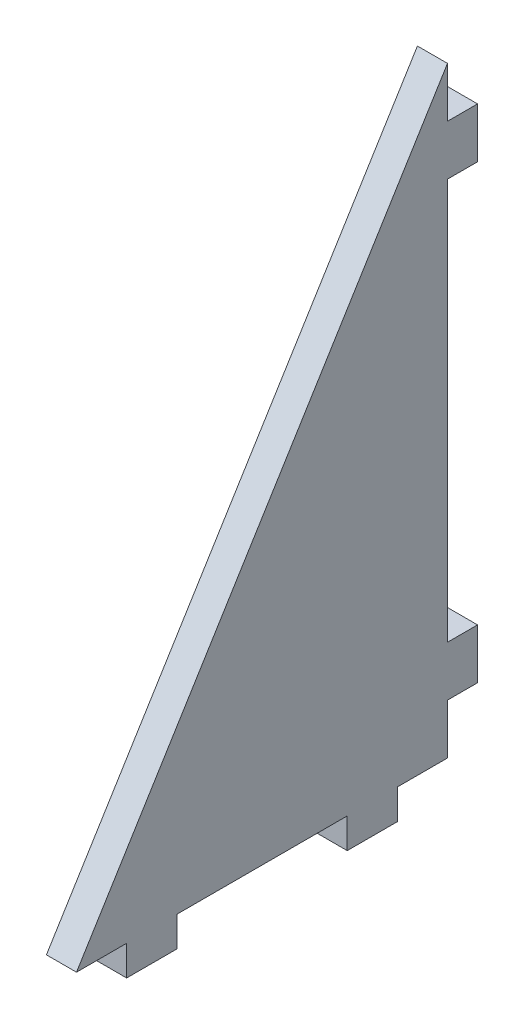
ISO-10303-21;
HEADER;
FILE_DESCRIPTION(('STEP AP214'),'2;1');
FILE_NAME('part.step','',(''),(''),'','','');
FILE_SCHEMA(('AUTOMOTIVE_DESIGN { 1 0 10303 214 1 1 1 1 }'));
ENDSEC;
DATA;
#1=APPLICATION_CONTEXT('core data for automotive mechanical design processes');
#2=APPLICATION_PROTOCOL_DEFINITION('international standard','automotive_design',2000,#1);
#3=PRODUCT_CONTEXT('',#1,'mechanical');
#4=PRODUCT('Part','Part','',(#3));
#5=PRODUCT_RELATED_PRODUCT_CATEGORY('part','',(#4));
#6=PRODUCT_DEFINITION_FORMATION('','',#4);
#7=PRODUCT_DEFINITION_CONTEXT('part definition',#1,'design');
#8=PRODUCT_DEFINITION('design','',#6,#7);
#9=PRODUCT_DEFINITION_SHAPE('','',#8);
#10=(LENGTH_UNIT() NAMED_UNIT(*) SI_UNIT(.MILLI.,.METRE.));
#11=(NAMED_UNIT(*) PLANE_ANGLE_UNIT() SI_UNIT($,.RADIAN.));
#12=(NAMED_UNIT(*) SI_UNIT($,.STERADIAN.) SOLID_ANGLE_UNIT());
#13=UNCERTAINTY_MEASURE_WITH_UNIT(LENGTH_MEASURE(1.E-05),#10,'distance_accuracy_value','');
#14=(GEOMETRIC_REPRESENTATION_CONTEXT(3) GLOBAL_UNCERTAINTY_ASSIGNED_CONTEXT((#13)) GLOBAL_UNIT_ASSIGNED_CONTEXT((#10,
#11,#12)) REPRESENTATION_CONTEXT('',''));
#15=CARTESIAN_POINT('',(0.,0.,0.));
#16=DIRECTION('',(0.,0.,1.));
#17=DIRECTION('',(1.,0.,0.));
#18=AXIS2_PLACEMENT_3D('',#15,#16,#17);
#19=CARTESIAN_POINT('',(3.,-30.,-18.5));
#20=DIRECTION('',(0.,0.,1.));
#21=DIRECTION('',(1.,0.,0.));
#22=AXIS2_PLACEMENT_3D('',#19,#20,#21);
#23=PLANE('',#22);
#24=DIRECTION('',(-1.,0.,0.));
#25=VECTOR('',#24,1.);
#26=CARTESIAN_POINT('',(3.,20.,-18.5));
#27=LINE('',#26,#25);
#28=CARTESIAN_POINT('',(3.,20.,-18.5));
#29=VERTEX_POINT('',#28);
#30=CARTESIAN_POINT('',(0.,20.,-18.5));
#31=VERTEX_POINT('',#30);
#32=EDGE_CURVE('E55',#29,#31,#27,.T.);
#33=ORIENTED_EDGE('',*,*,#32,.F.);
#34=DIRECTION('',(0.,1.,0.));
#35=VECTOR('',#34,1.);
#36=CARTESIAN_POINT('',(3.,-30.,-18.5));
#37=LINE('',#36,#35);
#38=CARTESIAN_POINT('',(3.,-20.,-18.5));
#39=VERTEX_POINT('',#38);
#40=EDGE_CURVE('E188',#39,#29,#37,.T.);
#41=ORIENTED_EDGE('',*,*,#40,.F.);
#42=DIRECTION('',(1.,0.,0.));
#43=VECTOR('',#42,1.);
#44=CARTESIAN_POINT('',(3.,-20.,-18.5));
#45=LINE('',#44,#43);
#46=CARTESIAN_POINT('',(0.,-20.,-18.5));
#47=VERTEX_POINT('',#46);
#48=EDGE_CURVE('E192',#47,#39,#45,.T.);
#49=ORIENTED_EDGE('',*,*,#48,.F.);
#50=DIRECTION('',(0.,1.,0.));
#51=VECTOR('',#50,1.);
#52=CARTESIAN_POINT('',(0.,-30.,-18.5));
#53=LINE('',#52,#51);
#54=EDGE_CURVE('E292',#47,#31,#53,.T.);
#55=ORIENTED_EDGE('',*,*,#54,.T.);
#56=EDGE_LOOP('',(#33,#41,#49,#55));
#57=FACE_BOUND('',#56,.T.);
#58=ADVANCED_FACE('F33',(#57),#23,.F.);
#59=DIRECTION('',(1.,0.,0.));
#60=VECTOR('',#59,1.);
#61=CARTESIAN_POINT('',(3.,25.,-18.5));
#62=LINE('',#61,#60);
#63=CARTESIAN_POINT('',(0.,25.,-18.5));
#64=VERTEX_POINT('',#63);
#65=CARTESIAN_POINT('',(3.,25.,-18.5));
#66=VERTEX_POINT('',#65);
#67=EDGE_CURVE('E183',#64,#66,#62,.T.);
#68=ORIENTED_EDGE('',*,*,#67,.F.);
#69=CARTESIAN_POINT('',(0.,30.,-18.5));
#70=VERTEX_POINT('',#69);
#71=EDGE_CURVE('E278',#64,#70,#53,.T.);
#72=ORIENTED_EDGE('',*,*,#71,.T.);
#73=DIRECTION('',(-1.,0.,0.));
#74=VECTOR('',#73,1.);
#75=CARTESIAN_POINT('',(3.,30.,-18.5));
#76=LINE('',#75,#74);
#77=CARTESIAN_POINT('',(3.,30.,-18.5));
#78=VERTEX_POINT('',#77);
#79=EDGE_CURVE('E11',#78,#70,#76,.T.);
#80=ORIENTED_EDGE('',*,*,#79,.F.);
#81=EDGE_CURVE('E47',#66,#78,#37,.T.);
#82=ORIENTED_EDGE('',*,*,#81,.F.);
#83=EDGE_LOOP('',(#68,#72,#80,#82));
#84=FACE_BOUND('',#83,.T.);
#85=ADVANCED_FACE('F315',(#84),#23,.F.);
#86=DIRECTION('',(-1.,0.,0.));
#87=VECTOR('',#86,1.);
#88=CARTESIAN_POINT('',(3.,-25.,-18.5));
#89=LINE('',#88,#87);
#90=CARTESIAN_POINT('',(3.,-25.,-18.5));
#91=VERTEX_POINT('',#90);
#92=CARTESIAN_POINT('',(0.,-25.,-18.5));
#93=VERTEX_POINT('',#92);
#94=EDGE_CURVE('E189',#91,#93,#89,.T.);
#95=ORIENTED_EDGE('',*,*,#94,.F.);
#96=CARTESIAN_POINT('',(3.,-30.,-18.5));
#97=VERTEX_POINT('',#96);
#98=EDGE_CURVE('E281',#97,#91,#37,.T.);
#99=ORIENTED_EDGE('',*,*,#98,.F.);
#100=DIRECTION('',(-1.,0.,0.));
#101=VECTOR('',#100,1.);
#102=CARTESIAN_POINT('',(3.,-30.,-18.5));
#103=LINE('',#102,#101);
#104=CARTESIAN_POINT('',(0.,-30.,-18.5));
#105=VERTEX_POINT('',#104);
#106=EDGE_CURVE('E287',#97,#105,#103,.T.);
#107=ORIENTED_EDGE('',*,*,#106,.T.);
#108=EDGE_CURVE('E289',#105,#93,#53,.T.);
#109=ORIENTED_EDGE('',*,*,#108,.T.);
#110=EDGE_LOOP('',(#95,#99,#107,#109));
#111=FACE_BOUND('',#110,.T.);
#112=ADVANCED_FACE('F338',(#111),#23,.F.);
#113=CARTESIAN_POINT('',(3.,-30.,18.5));
#114=DIRECTION('',(0.,1.,0.));
#115=DIRECTION('',(0.,0.,1.));
#116=AXIS2_PLACEMENT_3D('',#113,#114,#115);
#117=PLANE('',#116);
#118=DIRECTION('',(-1.,0.,0.));
#119=VECTOR('',#118,1.);
#120=CARTESIAN_POINT('',(3.,-30.,-8.5));
#121=LINE('',#120,#119);
#122=CARTESIAN_POINT('',(3.,-30.,-8.5));
#123=VERTEX_POINT('',#122);
#124=CARTESIAN_POINT('',(0.,-30.,-8.5));
#125=VERTEX_POINT('',#124);
#126=EDGE_CURVE('E220',#123,#125,#121,.T.);
#127=ORIENTED_EDGE('',*,*,#126,.F.);
#128=DIRECTION('',(0.,0.,-1.));
#129=VECTOR('',#128,1.);
#130=CARTESIAN_POINT('',(3.,-30.,18.5));
#131=LINE('',#130,#129);
#132=CARTESIAN_POINT('',(3.,-30.,8.5));
#133=VERTEX_POINT('',#132);
#134=EDGE_CURVE('E288',#133,#123,#131,.T.);
#135=ORIENTED_EDGE('',*,*,#134,.F.);
#136=DIRECTION('',(1.,0.,0.));
#137=VECTOR('',#136,1.);
#138=CARTESIAN_POINT('',(0.,-30.,8.5));
#139=LINE('',#138,#137);
#140=CARTESIAN_POINT('',(0.,-30.,8.5));
#141=VERTEX_POINT('',#140);
#142=EDGE_CURVE('E247',#141,#133,#139,.T.);
#143=ORIENTED_EDGE('',*,*,#142,.F.);
#144=DIRECTION('',(0.,0.,-1.));
#145=VECTOR('',#144,1.);
#146=CARTESIAN_POINT('',(0.,-30.,18.5));
#147=LINE('',#146,#145);
#148=EDGE_CURVE('E295',#141,#125,#147,.T.);
#149=ORIENTED_EDGE('',*,*,#148,.T.);
#150=EDGE_LOOP('',(#127,#135,#143,#149));
#151=FACE_BOUND('',#150,.T.);
#152=ADVANCED_FACE('F343',(#151),#117,.F.);
#153=DIRECTION('',(1.,0.,0.));
#154=VECTOR('',#153,1.);
#155=CARTESIAN_POINT('',(3.,-30.,-13.5));
#156=LINE('',#155,#154);
#157=CARTESIAN_POINT('',(0.,-30.,-13.5));
#158=VERTEX_POINT('',#157);
#159=CARTESIAN_POINT('',(3.,-30.,-13.5));
#160=VERTEX_POINT('',#159);
#161=EDGE_CURVE('E225',#158,#160,#156,.T.);
#162=ORIENTED_EDGE('',*,*,#161,.F.);
#163=EDGE_CURVE('E291',#158,#105,#147,.T.);
#164=ORIENTED_EDGE('',*,*,#163,.T.);
#165=ORIENTED_EDGE('',*,*,#106,.F.);
#166=EDGE_CURVE('E283',#160,#97,#131,.T.);
#167=ORIENTED_EDGE('',*,*,#166,.F.);
#168=EDGE_LOOP('',(#162,#164,#165,#167));
#169=FACE_BOUND('',#168,.T.);
#170=ADVANCED_FACE('F348',(#169),#117,.F.);
#171=DIRECTION('',(-1.,0.,0.));
#172=VECTOR('',#171,1.);
#173=CARTESIAN_POINT('',(0.,-30.,13.5));
#174=LINE('',#173,#172);
#175=CARTESIAN_POINT('',(3.,-30.,13.5));
#176=VERTEX_POINT('',#175);
#177=CARTESIAN_POINT('',(0.,-30.,13.5));
#178=VERTEX_POINT('',#177);
#179=EDGE_CURVE('E252',#176,#178,#174,.T.);
#180=ORIENTED_EDGE('',*,*,#179,.F.);
#181=CARTESIAN_POINT('',(3.,-30.,18.5));
#182=VERTEX_POINT('',#181);
#183=EDGE_CURVE('E284',#182,#176,#131,.T.);
#184=ORIENTED_EDGE('',*,*,#183,.F.);
#185=DIRECTION('',(-1.,0.,0.));
#186=VECTOR('',#185,1.);
#187=CARTESIAN_POINT('',(3.,-30.,18.5));
#188=LINE('',#187,#186);
#189=CARTESIAN_POINT('',(0.,-30.,18.5));
#190=VERTEX_POINT('',#189);
#191=EDGE_CURVE('E40',#182,#190,#188,.T.);
#192=ORIENTED_EDGE('',*,*,#191,.T.);
#193=EDGE_CURVE('E293',#190,#178,#147,.T.);
#194=ORIENTED_EDGE('',*,*,#193,.T.);
#195=EDGE_LOOP('',(#180,#184,#192,#194));
#196=FACE_BOUND('',#195,.T.);
#197=ADVANCED_FACE('F301',(#196),#117,.F.);
#198=CARTESIAN_POINT('',(3.,0.,0.));
#199=DIRECTION('',(-1.,0.,0.));
#200=DIRECTION('',(0.,0.,1.));
#201=AXIS2_PLACEMENT_3D('',#198,#199,#200);
#202=PLANE('',#201);
#203=ORIENTED_EDGE('',*,*,#98,.T.);
#204=DIRECTION('',(0.,0.,1.));
#205=VECTOR('',#204,1.);
#206=CARTESIAN_POINT('',(3.,-25.,-21.5));
#207=LINE('',#206,#205);
#208=CARTESIAN_POINT('',(3.,-25.,-21.5));
#209=VERTEX_POINT('',#208);
#210=EDGE_CURVE('E217',#209,#91,#207,.T.);
#211=ORIENTED_EDGE('',*,*,#210,.F.);
#212=DIRECTION('',(0.,-1.,0.));
#213=VECTOR('',#212,1.);
#214=CARTESIAN_POINT('',(3.,-25.,-21.5));
#215=LINE('',#214,#213);
#216=CARTESIAN_POINT('',(3.,-20.,-21.5));
#217=VERTEX_POINT('',#216);
#218=EDGE_CURVE('E198',#217,#209,#215,.T.);
#219=ORIENTED_EDGE('',*,*,#218,.F.);
#220=DIRECTION('',(0.,0.,1.));
#221=VECTOR('',#220,1.);
#222=CARTESIAN_POINT('',(3.,-20.,-21.5));
#223=LINE('',#222,#221);
#224=EDGE_CURVE('E206',#217,#39,#223,.T.);
#225=ORIENTED_EDGE('',*,*,#224,.T.);
#226=ORIENTED_EDGE('',*,*,#40,.T.);
#227=DIRECTION('',(0.,0.,1.));
#228=VECTOR('',#227,1.);
#229=CARTESIAN_POINT('',(3.,20.,-21.5));
#230=LINE('',#229,#228);
#231=CARTESIAN_POINT('',(3.,20.,-21.5));
#232=VERTEX_POINT('',#231);
#233=EDGE_CURVE('E168',#232,#29,#230,.T.);
#234=ORIENTED_EDGE('',*,*,#233,.F.);
#235=DIRECTION('',(0.,-1.,0.));
#236=VECTOR('',#235,1.);
#237=CARTESIAN_POINT('',(3.,20.,-21.5));
#238=LINE('',#237,#236);
#239=CARTESIAN_POINT('',(3.,25.,-21.5));
#240=VERTEX_POINT('',#239);
#241=EDGE_CURVE('E174',#240,#232,#238,.T.);
#242=ORIENTED_EDGE('',*,*,#241,.F.);
#243=DIRECTION('',(0.,0.,1.));
#244=VECTOR('',#243,1.);
#245=CARTESIAN_POINT('',(3.,25.,-21.5));
#246=LINE('',#245,#244);
#247=EDGE_CURVE('E322',#240,#66,#246,.T.);
#248=ORIENTED_EDGE('',*,*,#247,.T.);
#249=ORIENTED_EDGE('',*,*,#81,.T.);
#250=DIRECTION('',(0.,0.85117086972399,-0.524888702996461));
#251=VECTOR('',#250,1.);
#252=CARTESIAN_POINT('',(3.,-30.,18.5));
#253=LINE('',#252,#251);
#254=EDGE_CURVE('E274',#182,#78,#253,.T.);
#255=ORIENTED_EDGE('',*,*,#254,.F.);
#256=ORIENTED_EDGE('',*,*,#183,.T.);
#257=DIRECTION('',(0.,1.,0.));
#258=VECTOR('',#257,1.);
#259=CARTESIAN_POINT('',(3.,-33.,13.5));
#260=LINE('',#259,#258);
#261=CARTESIAN_POINT('',(3.,-33.,13.5));
#262=VERTEX_POINT('',#261);
#263=EDGE_CURVE('E265',#262,#176,#260,.T.);
#264=ORIENTED_EDGE('',*,*,#263,.F.);
#265=DIRECTION('',(0.,0.,1.));
#266=VECTOR('',#265,1.);
#267=CARTESIAN_POINT('',(3.,-33.,13.5));
#268=LINE('',#267,#266);
#269=CARTESIAN_POINT('',(3.,-33.,8.5));
#270=VERTEX_POINT('',#269);
#271=EDGE_CURVE('E254',#270,#262,#268,.T.);
#272=ORIENTED_EDGE('',*,*,#271,.F.);
#273=DIRECTION('',(0.,1.,0.));
#274=VECTOR('',#273,1.);
#275=CARTESIAN_POINT('',(3.,-33.,8.5));
#276=LINE('',#275,#274);
#277=EDGE_CURVE('E268',#270,#133,#276,.T.);
#278=ORIENTED_EDGE('',*,*,#277,.T.);
#279=ORIENTED_EDGE('',*,*,#134,.T.);
#280=DIRECTION('',(0.,1.,0.));
#281=VECTOR('',#280,1.);
#282=CARTESIAN_POINT('',(3.,-33.,-8.5));
#283=LINE('',#282,#281);
#284=CARTESIAN_POINT('',(3.,-33.,-8.5));
#285=VERTEX_POINT('',#284);
#286=EDGE_CURVE('E244',#285,#123,#283,.T.);
#287=ORIENTED_EDGE('',*,*,#286,.F.);
#288=DIRECTION('',(0.,0.,1.));
#289=VECTOR('',#288,1.);
#290=CARTESIAN_POINT('',(3.,-33.,-8.5));
#291=LINE('',#290,#289);
#292=CARTESIAN_POINT('',(3.,-33.,-13.5));
#293=VERTEX_POINT('',#292);
#294=EDGE_CURVE('E221',#293,#285,#291,.T.);
#295=ORIENTED_EDGE('',*,*,#294,.F.);
#296=DIRECTION('',(0.,1.,0.));
#297=VECTOR('',#296,1.);
#298=CARTESIAN_POINT('',(3.,-33.,-13.5));
#299=LINE('',#298,#297);
#300=EDGE_CURVE('E231',#293,#160,#299,.T.);
#301=ORIENTED_EDGE('',*,*,#300,.T.);
#302=ORIENTED_EDGE('',*,*,#166,.T.);
#303=EDGE_LOOP('',(#203,#211,#219,#225,#226,#234,#242,#248,#249,#255,#256,#264,#272,#278,#279,
#287,#295,#301,#302));
#304=FACE_BOUND('',#303,.T.);
#305=ADVANCED_FACE('F186',(#304),#202,.F.);
#306=CARTESIAN_POINT('',(0.,0.,0.));
#307=DIRECTION('',(-1.,0.,0.));
#308=DIRECTION('',(0.,0.,1.));
#309=AXIS2_PLACEMENT_3D('',#306,#307,#308);
#310=PLANE('',#309);
#311=DIRECTION('',(0.,0.85117086972399,-0.524888702996461));
#312=VECTOR('',#311,1.);
#313=CARTESIAN_POINT('',(0.,-30.,18.5));
#314=LINE('',#313,#312);
#315=EDGE_CURVE('E275',#190,#70,#314,.T.);
#316=ORIENTED_EDGE('',*,*,#315,.T.);
#317=ORIENTED_EDGE('',*,*,#71,.F.);
#318=DIRECTION('',(0.,0.,1.));
#319=VECTOR('',#318,1.);
#320=CARTESIAN_POINT('',(0.,25.,-21.5));
#321=LINE('',#320,#319);
#322=CARTESIAN_POINT('',(0.,25.,-21.5));
#323=VERTEX_POINT('',#322);
#324=EDGE_CURVE('E194',#323,#64,#321,.T.);
#325=ORIENTED_EDGE('',*,*,#324,.F.);
#326=DIRECTION('',(0.,1.,0.));
#327=VECTOR('',#326,1.);
#328=CARTESIAN_POINT('',(0.,20.,-21.5));
#329=LINE('',#328,#327);
#330=CARTESIAN_POINT('',(0.,20.,-21.5));
#331=VERTEX_POINT('',#330);
#332=EDGE_CURVE('E173',#331,#323,#329,.T.);
#333=ORIENTED_EDGE('',*,*,#332,.F.);
#334=DIRECTION('',(0.,0.,1.));
#335=VECTOR('',#334,1.);
#336=CARTESIAN_POINT('',(0.,20.,-21.5));
#337=LINE('',#336,#335);
#338=EDGE_CURVE('E170',#331,#31,#337,.T.);
#339=ORIENTED_EDGE('',*,*,#338,.T.);
#340=ORIENTED_EDGE('',*,*,#54,.F.);
#341=DIRECTION('',(0.,0.,1.));
#342=VECTOR('',#341,1.);
#343=CARTESIAN_POINT('',(0.,-20.,-21.5));
#344=LINE('',#343,#342);
#345=CARTESIAN_POINT('',(0.,-20.,-21.5));
#346=VERTEX_POINT('',#345);
#347=EDGE_CURVE('E211',#346,#47,#344,.T.);
#348=ORIENTED_EDGE('',*,*,#347,.F.);
#349=DIRECTION('',(0.,1.,0.));
#350=VECTOR('',#349,1.);
#351=CARTESIAN_POINT('',(0.,-25.,-21.5));
#352=LINE('',#351,#350);
#353=CARTESIAN_POINT('',(0.,-25.,-21.5));
#354=VERTEX_POINT('',#353);
#355=EDGE_CURVE('E203',#354,#346,#352,.T.);
#356=ORIENTED_EDGE('',*,*,#355,.F.);
#357=DIRECTION('',(0.,0.,1.));
#358=VECTOR('',#357,1.);
#359=CARTESIAN_POINT('',(0.,-25.,-21.5));
#360=LINE('',#359,#358);
#361=EDGE_CURVE('E214',#354,#93,#360,.T.);
#362=ORIENTED_EDGE('',*,*,#361,.T.);
#363=ORIENTED_EDGE('',*,*,#108,.F.);
#364=ORIENTED_EDGE('',*,*,#163,.F.);
#365=DIRECTION('',(0.,1.,0.));
#366=VECTOR('',#365,1.);
#367=CARTESIAN_POINT('',(0.,-33.,-13.5));
#368=LINE('',#367,#366);
#369=CARTESIAN_POINT('',(0.,-33.,-13.5));
#370=VERTEX_POINT('',#369);
#371=EDGE_CURVE('E238',#370,#158,#368,.T.);
#372=ORIENTED_EDGE('',*,*,#371,.F.);
#373=DIRECTION('',(0.,0.,-1.));
#374=VECTOR('',#373,1.);
#375=CARTESIAN_POINT('',(0.,-33.,-8.5));
#376=LINE('',#375,#374);
#377=CARTESIAN_POINT('',(0.,-33.,-8.5));
#378=VERTEX_POINT('',#377);
#379=EDGE_CURVE('E227',#378,#370,#376,.T.);
#380=ORIENTED_EDGE('',*,*,#379,.F.);
#381=DIRECTION('',(0.,1.,0.));
#382=VECTOR('',#381,1.);
#383=CARTESIAN_POINT('',(0.,-33.,-8.5));
#384=LINE('',#383,#382);
#385=EDGE_CURVE('E241',#378,#125,#384,.T.);
#386=ORIENTED_EDGE('',*,*,#385,.T.);
#387=ORIENTED_EDGE('',*,*,#148,.F.);
#388=DIRECTION('',(0.,1.,0.));
#389=VECTOR('',#388,1.);
#390=CARTESIAN_POINT('',(0.,-33.,8.5));
#391=LINE('',#390,#389);
#392=CARTESIAN_POINT('',(0.,-33.,8.5));
#393=VERTEX_POINT('',#392);
#394=EDGE_CURVE('E271',#393,#141,#391,.T.);
#395=ORIENTED_EDGE('',*,*,#394,.F.);
#396=DIRECTION('',(0.,0.,-1.));
#397=VECTOR('',#396,1.);
#398=CARTESIAN_POINT('',(0.,-33.,13.5));
#399=LINE('',#398,#397);
#400=CARTESIAN_POINT('',(0.,-33.,13.5));
#401=VERTEX_POINT('',#400);
#402=EDGE_CURVE('E248',#401,#393,#399,.T.);
#403=ORIENTED_EDGE('',*,*,#402,.F.);
#404=DIRECTION('',(0.,1.,0.));
#405=VECTOR('',#404,1.);
#406=CARTESIAN_POINT('',(0.,-33.,13.5));
#407=LINE('',#406,#405);
#408=EDGE_CURVE('E258',#401,#178,#407,.T.);
#409=ORIENTED_EDGE('',*,*,#408,.T.);
#410=ORIENTED_EDGE('',*,*,#193,.F.);
#411=EDGE_LOOP('',(#316,#317,#325,#333,#339,#340,#348,#356,#362,#363,#364,#372,#380,#386,#387,
#395,#403,#409,#410));
#412=FACE_BOUND('',#411,.T.);
#413=ADVANCED_FACE('F305',(#412),#310,.T.);
#414=CARTESIAN_POINT('',(0.,-30.,18.5));
#415=DIRECTION('',(0.,-0.52488870299646,-0.85117086972399));
#416=DIRECTION('',(0.,0.85117086972399,-0.524888702996461));
#417=AXIS2_PLACEMENT_3D('',#414,#415,#416);
#418=PLANE('',#417);
#419=ORIENTED_EDGE('',*,*,#254,.T.);
#420=ORIENTED_EDGE('',*,*,#79,.T.);
#421=ORIENTED_EDGE('',*,*,#315,.F.);
#422=ORIENTED_EDGE('',*,*,#191,.F.);
#423=EDGE_LOOP('',(#419,#420,#421,#422));
#424=FACE_BOUND('',#423,.T.);
#425=ADVANCED_FACE('F314',(#424),#418,.F.);
#426=CARTESIAN_POINT('',(0.,-33.,8.5));
#427=DIRECTION('',(0.,0.,1.));
#428=DIRECTION('',(1.,0.,0.));
#429=AXIS2_PLACEMENT_3D('',#426,#427,#428);
#430=PLANE('',#429);
#431=ORIENTED_EDGE('',*,*,#142,.T.);
#432=ORIENTED_EDGE('',*,*,#277,.F.);
#433=DIRECTION('',(1.,0.,0.));
#434=VECTOR('',#433,1.);
#435=CARTESIAN_POINT('',(0.,-33.,8.5));
#436=LINE('',#435,#434);
#437=EDGE_CURVE('E251',#393,#270,#436,.T.);
#438=ORIENTED_EDGE('',*,*,#437,.F.);
#439=ORIENTED_EDGE('',*,*,#394,.T.);
#440=EDGE_LOOP('',(#431,#432,#438,#439));
#441=FACE_BOUND('',#440,.T.);
#442=ADVANCED_FACE('F383',(#441),#430,.F.);
#443=CARTESIAN_POINT('',(0.,-33.,13.5));
#444=DIRECTION('',(0.,0.,-1.));
#445=DIRECTION('',(-1.,0.,0.));
#446=AXIS2_PLACEMENT_3D('',#443,#444,#445);
#447=PLANE('',#446);
#448=ORIENTED_EDGE('',*,*,#179,.T.);
#449=ORIENTED_EDGE('',*,*,#408,.F.);
#450=DIRECTION('',(-1.,0.,0.));
#451=VECTOR('',#450,1.);
#452=CARTESIAN_POINT('',(0.,-33.,13.5));
#453=LINE('',#452,#451);
#454=EDGE_CURVE('E256',#262,#401,#453,.T.);
#455=ORIENTED_EDGE('',*,*,#454,.F.);
#456=ORIENTED_EDGE('',*,*,#263,.T.);
#457=EDGE_LOOP('',(#448,#449,#455,#456));
#458=FACE_BOUND('',#457,.T.);
#459=ADVANCED_FACE('F311',(#458),#447,.F.);
#460=CARTESIAN_POINT('',(0.,-33.,0.));
#461=DIRECTION('',(0.,-1.,0.));
#462=DIRECTION('',(0.,0.,-1.));
#463=AXIS2_PLACEMENT_3D('',#460,#461,#462);
#464=PLANE('',#463);
#465=ORIENTED_EDGE('',*,*,#402,.T.);
#466=ORIENTED_EDGE('',*,*,#437,.T.);
#467=ORIENTED_EDGE('',*,*,#271,.T.);
#468=ORIENTED_EDGE('',*,*,#454,.T.);
#469=EDGE_LOOP('',(#465,#466,#467,#468));
#470=FACE_BOUND('',#469,.T.);
#471=ADVANCED_FACE('F385',(#470),#464,.T.);
#472=CARTESIAN_POINT('',(3.,-33.,-8.5));
#473=DIRECTION('',(0.,0.,-1.));
#474=DIRECTION('',(-1.,0.,0.));
#475=AXIS2_PLACEMENT_3D('',#472,#473,#474);
#476=PLANE('',#475);
#477=ORIENTED_EDGE('',*,*,#126,.T.);
#478=ORIENTED_EDGE('',*,*,#385,.F.);
#479=DIRECTION('',(-1.,0.,0.));
#480=VECTOR('',#479,1.);
#481=CARTESIAN_POINT('',(3.,-33.,-8.5));
#482=LINE('',#481,#480);
#483=EDGE_CURVE('E224',#285,#378,#482,.T.);
#484=ORIENTED_EDGE('',*,*,#483,.F.);
#485=ORIENTED_EDGE('',*,*,#286,.T.);
#486=EDGE_LOOP('',(#477,#478,#484,#485));
#487=FACE_BOUND('',#486,.T.);
#488=ADVANCED_FACE('F379',(#487),#476,.F.);
#489=CARTESIAN_POINT('',(3.,-33.,-13.5));
#490=DIRECTION('',(0.,0.,1.));
#491=DIRECTION('',(1.,0.,0.));
#492=AXIS2_PLACEMENT_3D('',#489,#490,#491);
#493=PLANE('',#492);
#494=ORIENTED_EDGE('',*,*,#161,.T.);
#495=ORIENTED_EDGE('',*,*,#300,.F.);
#496=DIRECTION('',(1.,0.,0.));
#497=VECTOR('',#496,1.);
#498=CARTESIAN_POINT('',(3.,-33.,-13.5));
#499=LINE('',#498,#497);
#500=EDGE_CURVE('E229',#370,#293,#499,.T.);
#501=ORIENTED_EDGE('',*,*,#500,.F.);
#502=ORIENTED_EDGE('',*,*,#371,.T.);
#503=EDGE_LOOP('',(#494,#495,#501,#502));
#504=FACE_BOUND('',#503,.T.);
#505=ADVANCED_FACE('F371',(#504),#493,.F.);
#506=CARTESIAN_POINT('',(0.,-33.,0.));
#507=DIRECTION('',(0.,1.,0.));
#508=DIRECTION('',(0.,0.,1.));
#509=AXIS2_PLACEMENT_3D('',#506,#507,#508);
#510=PLANE('',#509);
#511=ORIENTED_EDGE('',*,*,#294,.T.);
#512=ORIENTED_EDGE('',*,*,#483,.T.);
#513=ORIENTED_EDGE('',*,*,#379,.T.);
#514=ORIENTED_EDGE('',*,*,#500,.T.);
#515=EDGE_LOOP('',(#511,#512,#513,#514));
#516=FACE_BOUND('',#515,.T.);
#517=ADVANCED_FACE('F374',(#516),#510,.F.);
#518=CARTESIAN_POINT('',(3.,-25.,-21.5));
#519=DIRECTION('',(0.,1.,0.));
#520=DIRECTION('',(0.,0.,1.));
#521=AXIS2_PLACEMENT_3D('',#518,#519,#520);
#522=PLANE('',#521);
#523=ORIENTED_EDGE('',*,*,#94,.T.);
#524=ORIENTED_EDGE('',*,*,#361,.F.);
#525=DIRECTION('',(-1.,0.,0.));
#526=VECTOR('',#525,1.);
#527=CARTESIAN_POINT('',(3.,-25.,-21.5));
#528=LINE('',#527,#526);
#529=EDGE_CURVE('E201',#209,#354,#528,.T.);
#530=ORIENTED_EDGE('',*,*,#529,.F.);
#531=ORIENTED_EDGE('',*,*,#210,.T.);
#532=EDGE_LOOP('',(#523,#524,#530,#531));
#533=FACE_BOUND('',#532,.T.);
#534=ADVANCED_FACE('F357',(#533),#522,.F.);
#535=CARTESIAN_POINT('',(3.,-20.,-21.5));
#536=DIRECTION('',(0.,-1.,0.));
#537=DIRECTION('',(0.,0.,-1.));
#538=AXIS2_PLACEMENT_3D('',#535,#536,#537);
#539=PLANE('',#538);
#540=ORIENTED_EDGE('',*,*,#48,.T.);
#541=ORIENTED_EDGE('',*,*,#224,.F.);
#542=DIRECTION('',(1.,0.,0.));
#543=VECTOR('',#542,1.);
#544=CARTESIAN_POINT('',(3.,-20.,-21.5));
#545=LINE('',#544,#543);
#546=EDGE_CURVE('E205',#346,#217,#545,.T.);
#547=ORIENTED_EDGE('',*,*,#546,.F.);
#548=ORIENTED_EDGE('',*,*,#347,.T.);
#549=EDGE_LOOP('',(#540,#541,#547,#548));
#550=FACE_BOUND('',#549,.T.);
#551=ADVANCED_FACE('F363',(#550),#539,.F.);
#552=CARTESIAN_POINT('',(0.,0.,-21.5));
#553=DIRECTION('',(0.,0.,1.));
#554=DIRECTION('',(1.,0.,0.));
#555=AXIS2_PLACEMENT_3D('',#552,#553,#554);
#556=PLANE('',#555);
#557=ORIENTED_EDGE('',*,*,#218,.T.);
#558=ORIENTED_EDGE('',*,*,#529,.T.);
#559=ORIENTED_EDGE('',*,*,#355,.T.);
#560=ORIENTED_EDGE('',*,*,#546,.T.);
#561=EDGE_LOOP('',(#557,#558,#559,#560));
#562=FACE_BOUND('',#561,.T.);
#563=ADVANCED_FACE('F335',(#562),#556,.F.);
#564=CARTESIAN_POINT('',(3.,20.,-21.5));
#565=DIRECTION('',(0.,1.,0.));
#566=DIRECTION('',(0.,0.,1.));
#567=AXIS2_PLACEMENT_3D('',#564,#565,#566);
#568=PLANE('',#567);
#569=ORIENTED_EDGE('',*,*,#32,.T.);
#570=ORIENTED_EDGE('',*,*,#338,.F.);
#571=DIRECTION('',(-1.,0.,0.));
#572=VECTOR('',#571,1.);
#573=CARTESIAN_POINT('',(3.,20.,-21.5));
#574=LINE('',#573,#572);
#575=EDGE_CURVE('E164',#232,#331,#574,.T.);
#576=ORIENTED_EDGE('',*,*,#575,.F.);
#577=ORIENTED_EDGE('',*,*,#233,.T.);
#578=EDGE_LOOP('',(#569,#570,#576,#577));
#579=FACE_BOUND('',#578,.T.);
#580=ADVANCED_FACE('F166',(#579),#568,.F.);
#581=CARTESIAN_POINT('',(3.,25.,-21.5));
#582=DIRECTION('',(0.,-1.,0.));
#583=DIRECTION('',(1.,0.,0.));
#584=AXIS2_PLACEMENT_3D('',#581,#582,#583);
#585=PLANE('',#584);
#586=ORIENTED_EDGE('',*,*,#67,.T.);
#587=ORIENTED_EDGE('',*,*,#247,.F.);
#588=DIRECTION('',(1.,0.,0.));
#589=VECTOR('',#588,1.);
#590=CARTESIAN_POINT('',(3.,25.,-21.5));
#591=LINE('',#590,#589);
#592=EDGE_CURVE('E179',#323,#240,#591,.T.);
#593=ORIENTED_EDGE('',*,*,#592,.F.);
#594=ORIENTED_EDGE('',*,*,#324,.T.);
#595=EDGE_LOOP('',(#586,#587,#593,#594));
#596=FACE_BOUND('',#595,.T.);
#597=ADVANCED_FACE('F327',(#596),#585,.F.);
#598=CARTESIAN_POINT('',(0.,0.,-21.5));
#599=DIRECTION('',(0.,0.,1.));
#600=DIRECTION('',(1.,0.,0.));
#601=AXIS2_PLACEMENT_3D('',#598,#599,#600);
#602=PLANE('',#601);
#603=ORIENTED_EDGE('',*,*,#241,.T.);
#604=ORIENTED_EDGE('',*,*,#575,.T.);
#605=ORIENTED_EDGE('',*,*,#332,.T.);
#606=ORIENTED_EDGE('',*,*,#592,.T.);
#607=EDGE_LOOP('',(#603,#604,#605,#606));
#608=FACE_BOUND('',#607,.T.);
#609=ADVANCED_FACE('F177',(#608),#602,.F.);
#610=CLOSED_SHELL('',(#58,#85,#112,#152,#170,#197,#305,#413,#425,#442,#459,#471,#488,#505,#517,
#534,#551,#563,#580,#597,#609));
#611=MANIFOLD_SOLID_BREP('B2',#610);
#612=ADVANCED_BREP_SHAPE_REPRESENTATION('',(#18,#611),#14);
#613=SHAPE_DEFINITION_REPRESENTATION(#9,#612);
ENDSEC;
END-ISO-10303-21;
